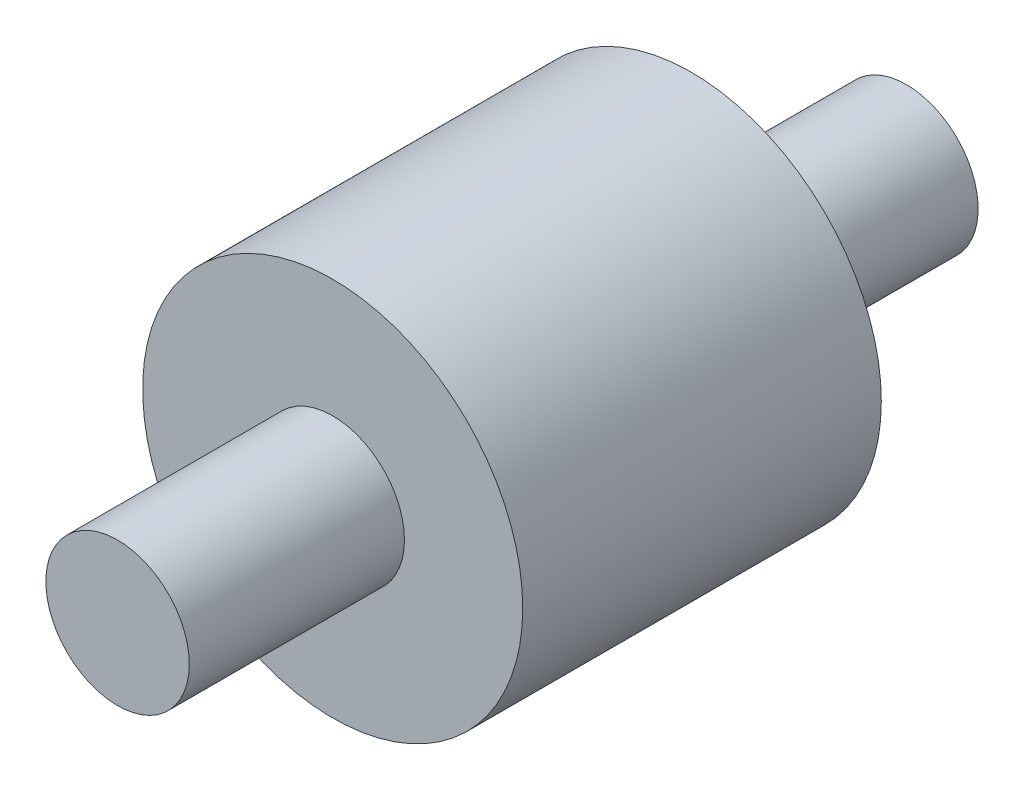
ISO-10303-21;
HEADER;
FILE_DESCRIPTION(('STEP AP214'),'2;1');
FILE_NAME('part.step','',(''),(''),'','','');
FILE_SCHEMA(('AUTOMOTIVE_DESIGN { 1 0 10303 214 1 1 1 1 }'));
ENDSEC;
DATA;
#1=APPLICATION_CONTEXT('core data for automotive mechanical design processes');
#2=APPLICATION_PROTOCOL_DEFINITION('international standard','automotive_design',2000,#1);
#3=PRODUCT_CONTEXT('',#1,'mechanical');
#4=PRODUCT('Part','Part','',(#3));
#5=PRODUCT_RELATED_PRODUCT_CATEGORY('part','',(#4));
#6=PRODUCT_DEFINITION_FORMATION('','',#4);
#7=PRODUCT_DEFINITION_CONTEXT('part definition',#1,'design');
#8=PRODUCT_DEFINITION('design','',#6,#7);
#9=PRODUCT_DEFINITION_SHAPE('','',#8);
#10=(LENGTH_UNIT() NAMED_UNIT(*) SI_UNIT(.MILLI.,.METRE.));
#11=(NAMED_UNIT(*) PLANE_ANGLE_UNIT() SI_UNIT($,.RADIAN.));
#12=(NAMED_UNIT(*) SI_UNIT($,.STERADIAN.) SOLID_ANGLE_UNIT());
#13=UNCERTAINTY_MEASURE_WITH_UNIT(LENGTH_MEASURE(1.E-05),#10,'distance_accuracy_value','');
#14=(GEOMETRIC_REPRESENTATION_CONTEXT(3) GLOBAL_UNCERTAINTY_ASSIGNED_CONTEXT((#13)) GLOBAL_UNIT_ASSIGNED_CONTEXT((#10,
#11,#12)) REPRESENTATION_CONTEXT('',''));
#15=CARTESIAN_POINT('',(0.,0.,0.));
#16=DIRECTION('',(0.,0.,1.));
#17=DIRECTION('',(1.,0.,0.));
#18=AXIS2_PLACEMENT_3D('',#15,#16,#17);
#19=CARTESIAN_POINT('',(0.,0.,25.));
#20=DIRECTION('',(0.,0.,-1.));
#21=DIRECTION('',(-1.,0.,0.));
#22=AXIS2_PLACEMENT_3D('',#19,#20,#21);
#23=CYLINDRICAL_SURFACE('',#22,26.5);
#24=CARTESIAN_POINT('',(0.,0.,25.));
#25=DIRECTION('',(0.,0.,1.));
#26=DIRECTION('',(1.,0.,0.));
#27=AXIS2_PLACEMENT_3D('',#24,#25,#26);
#28=CIRCLE('',#27,26.5);
#29=CARTESIAN_POINT('',(26.5,0.,25.));
#30=VERTEX_POINT('',#29);
#31=EDGE_CURVE('E51',#30,#30,#28,.T.);
#32=ORIENTED_EDGE('',*,*,#31,.F.);
#33=EDGE_LOOP('',(#32));
#34=FACE_BOUND('',#33,.T.);
#35=CARTESIAN_POINT('',(0.,0.,-25.));
#36=DIRECTION('',(0.,0.,1.));
#37=DIRECTION('',(1.,0.,0.));
#38=AXIS2_PLACEMENT_3D('',#35,#36,#37);
#39=CIRCLE('',#38,26.5);
#40=CARTESIAN_POINT('',(26.5,0.,-25.));
#41=VERTEX_POINT('',#40);
#42=EDGE_CURVE('E40',#41,#41,#39,.T.);
#43=ORIENTED_EDGE('',*,*,#42,.T.);
#44=EDGE_LOOP('',(#43));
#45=FACE_BOUND('',#44,.T.);
#46=ADVANCED_FACE('F37',(#34,#45),#23,.T.);
#47=CARTESIAN_POINT('',(0.,0.,25.));
#48=DIRECTION('',(0.,0.,1.));
#49=DIRECTION('',(1.,0.,0.));
#50=AXIS2_PLACEMENT_3D('',#47,#48,#49);
#51=PLANE('',#50);
#52=CARTESIAN_POINT('',(0.,0.,25.));
#53=DIRECTION('',(0.,0.,1.));
#54=DIRECTION('',(1.,0.,0.));
#55=AXIS2_PLACEMENT_3D('',#52,#53,#54);
#56=CIRCLE('',#55,10.);
#57=CARTESIAN_POINT('',(10.,0.,25.));
#58=VERTEX_POINT('',#57);
#59=EDGE_CURVE('E10',#58,#58,#56,.T.);
#60=ORIENTED_EDGE('',*,*,#59,.F.);
#61=EDGE_LOOP('',(#60));
#62=FACE_BOUND('',#61,.T.);
#63=ORIENTED_EDGE('',*,*,#31,.T.);
#64=EDGE_LOOP('',(#63));
#65=FACE_BOUND('',#64,.T.);
#66=ADVANCED_FACE('F71',(#62,#65),#51,.T.);
#67=CARTESIAN_POINT('',(0.,0.,-25.));
#68=DIRECTION('',(0.,0.,1.));
#69=DIRECTION('',(1.,0.,0.));
#70=AXIS2_PLACEMENT_3D('',#67,#68,#69);
#71=PLANE('',#70);
#72=CARTESIAN_POINT('',(0.,0.,-25.));
#73=DIRECTION('',(0.,0.,-1.));
#74=DIRECTION('',(-1.,0.,0.));
#75=AXIS2_PLACEMENT_3D('',#72,#73,#74);
#76=CIRCLE('',#75,10.);
#77=CARTESIAN_POINT('',(-10.,0.,-25.));
#78=VERTEX_POINT('',#77);
#79=EDGE_CURVE('E45',#78,#78,#76,.T.);
#80=ORIENTED_EDGE('',*,*,#79,.F.);
#81=EDGE_LOOP('',(#80));
#82=FACE_BOUND('',#81,.T.);
#83=ORIENTED_EDGE('',*,*,#42,.F.);
#84=EDGE_LOOP('',(#83));
#85=FACE_BOUND('',#84,.T.);
#86=ADVANCED_FACE('F68',(#82,#85),#71,.F.);
#87=CARTESIAN_POINT('',(0.,0.,-55.));
#88=DIRECTION('',(0.,0.,1.));
#89=DIRECTION('',(1.,0.,0.));
#90=AXIS2_PLACEMENT_3D('',#87,#88,#89);
#91=CYLINDRICAL_SURFACE('',#90,10.);
#92=CARTESIAN_POINT('',(0.,0.,-55.));
#93=DIRECTION('',(0.,0.,-1.));
#94=DIRECTION('',(-1.,0.,0.));
#95=AXIS2_PLACEMENT_3D('',#92,#93,#94);
#96=CIRCLE('',#95,10.);
#97=CARTESIAN_POINT('',(-10.,0.,-55.));
#98=VERTEX_POINT('',#97);
#99=EDGE_CURVE('E56',#98,#98,#96,.T.);
#100=ORIENTED_EDGE('',*,*,#99,.F.);
#101=EDGE_LOOP('',(#100));
#102=FACE_BOUND('',#101,.T.);
#103=ORIENTED_EDGE('',*,*,#79,.T.);
#104=EDGE_LOOP('',(#103));
#105=FACE_BOUND('',#104,.T.);
#106=ADVANCED_FACE('F70',(#102,#105),#91,.T.);
#107=CARTESIAN_POINT('',(0.,0.,-55.));
#108=DIRECTION('',(0.,0.,-1.));
#109=DIRECTION('',(-1.,0.,0.));
#110=AXIS2_PLACEMENT_3D('',#107,#108,#109);
#111=PLANE('',#110);
#112=ORIENTED_EDGE('',*,*,#99,.T.);
#113=EDGE_LOOP('',(#112));
#114=FACE_BOUND('',#113,.T.);
#115=ADVANCED_FACE('F77',(#114),#111,.T.);
#116=CARTESIAN_POINT('',(0.,0.,55.));
#117=DIRECTION('',(0.,0.,-1.));
#118=DIRECTION('',(-1.,0.,0.));
#119=AXIS2_PLACEMENT_3D('',#116,#117,#118);
#120=CYLINDRICAL_SURFACE('',#119,10.);
#121=CARTESIAN_POINT('',(0.,0.,55.));
#122=DIRECTION('',(0.,0.,1.));
#123=DIRECTION('',(1.,0.,0.));
#124=AXIS2_PLACEMENT_3D('',#121,#122,#123);
#125=CIRCLE('',#124,10.);
#126=CARTESIAN_POINT('',(10.,0.,55.));
#127=VERTEX_POINT('',#126);
#128=EDGE_CURVE('E55',#127,#127,#125,.T.);
#129=ORIENTED_EDGE('',*,*,#128,.F.);
#130=EDGE_LOOP('',(#129));
#131=FACE_BOUND('',#130,.T.);
#132=ORIENTED_EDGE('',*,*,#59,.T.);
#133=EDGE_LOOP('',(#132));
#134=FACE_BOUND('',#133,.T.);
#135=ADVANCED_FACE('F102',(#131,#134),#120,.T.);
#136=CARTESIAN_POINT('',(0.,0.,55.));
#137=DIRECTION('',(0.,0.,1.));
#138=DIRECTION('',(1.,0.,0.));
#139=AXIS2_PLACEMENT_3D('',#136,#137,#138);
#140=PLANE('',#139);
#141=ORIENTED_EDGE('',*,*,#128,.T.);
#142=EDGE_LOOP('',(#141));
#143=FACE_BOUND('',#142,.T.);
#144=ADVANCED_FACE('F107',(#143),#140,.T.);
#145=CLOSED_SHELL('',(#46,#66,#86,#106,#115,#135,#144));
#146=MANIFOLD_SOLID_BREP('B2',#145);
#147=ADVANCED_BREP_SHAPE_REPRESENTATION('',(#18,#146),#14);
#148=SHAPE_DEFINITION_REPRESENTATION(#9,#147);
ENDSEC;
END-ISO-10303-21;
